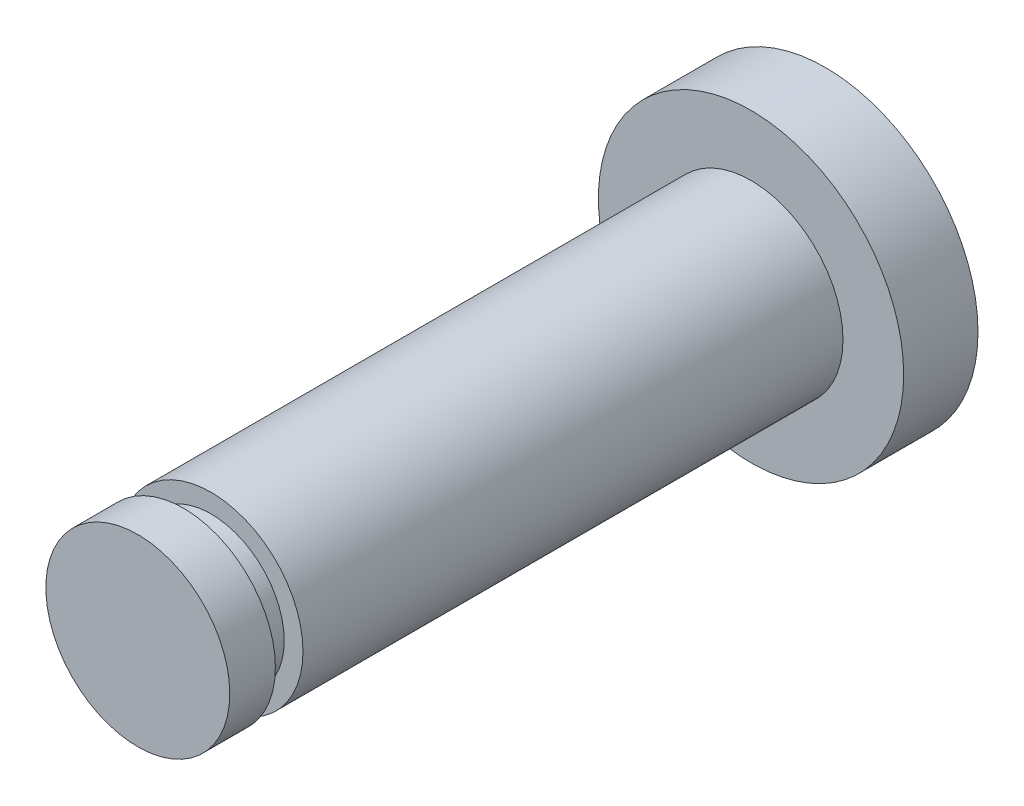
ISO-10303-21;
HEADER;
FILE_DESCRIPTION(('STEP AP214'),'2;1');
FILE_NAME('part.step','',(''),(''),'','','');
FILE_SCHEMA(('AUTOMOTIVE_DESIGN { 1 0 10303 214 1 1 1 1 }'));
ENDSEC;
DATA;
#1=APPLICATION_CONTEXT('core data for automotive mechanical design processes');
#2=APPLICATION_PROTOCOL_DEFINITION('international standard','automotive_design',2000,#1);
#3=PRODUCT_CONTEXT('',#1,'mechanical');
#4=PRODUCT('Part','Part','',(#3));
#5=PRODUCT_RELATED_PRODUCT_CATEGORY('part','',(#4));
#6=PRODUCT_DEFINITION_FORMATION('','',#4);
#7=PRODUCT_DEFINITION_CONTEXT('part definition',#1,'design');
#8=PRODUCT_DEFINITION('design','',#6,#7);
#9=PRODUCT_DEFINITION_SHAPE('','',#8);
#10=(LENGTH_UNIT() NAMED_UNIT(*) SI_UNIT(.MILLI.,.METRE.));
#11=(NAMED_UNIT(*) PLANE_ANGLE_UNIT() SI_UNIT($,.RADIAN.));
#12=(NAMED_UNIT(*) SI_UNIT($,.STERADIAN.) SOLID_ANGLE_UNIT());
#13=UNCERTAINTY_MEASURE_WITH_UNIT(LENGTH_MEASURE(1.E-05),#10,'distance_accuracy_value','');
#14=(GEOMETRIC_REPRESENTATION_CONTEXT(3) GLOBAL_UNCERTAINTY_ASSIGNED_CONTEXT((#13)) GLOBAL_UNIT_ASSIGNED_CONTEXT((#10,
#11,#12)) REPRESENTATION_CONTEXT('',''));
#15=CARTESIAN_POINT('',(0.,0.,0.));
#16=DIRECTION('',(0.,0.,1.));
#17=DIRECTION('',(1.,0.,0.));
#18=AXIS2_PLACEMENT_3D('',#15,#16,#17);
#19=CARTESIAN_POINT('',(0.,0.,9.44));
#20=DIRECTION('',(0.,0.,-1.));
#21=DIRECTION('',(-1.,0.,0.));
#22=AXIS2_PLACEMENT_3D('',#19,#20,#21);
#23=CYLINDRICAL_SURFACE('',#22,2.5);
#24=CARTESIAN_POINT('',(0.,0.,-7.23));
#25=DIRECTION('',(0.,0.,1.));
#26=DIRECTION('',(1.,0.,0.));
#27=AXIS2_PLACEMENT_3D('',#24,#25,#26);
#28=CIRCLE('',#27,2.5);
#29=CARTESIAN_POINT('',(2.5,0.,-7.23));
#30=VERTEX_POINT('',#29);
#31=EDGE_CURVE('E44',#30,#30,#28,.T.);
#32=ORIENTED_EDGE('',*,*,#31,.T.);
#33=EDGE_LOOP('',(#32));
#34=FACE_BOUND('',#33,.T.);
#35=CARTESIAN_POINT('',(0.,0.,7.45));
#36=DIRECTION('',(0.,0.,1.));
#37=DIRECTION('',(1.,0.,0.));
#38=AXIS2_PLACEMENT_3D('',#35,#36,#37);
#39=CIRCLE('',#38,2.5);
#40=CARTESIAN_POINT('',(2.5,0.,7.45));
#41=VERTEX_POINT('',#40);
#42=EDGE_CURVE('E54',#41,#41,#39,.T.);
#43=ORIENTED_EDGE('',*,*,#42,.F.);
#44=EDGE_LOOP('',(#43));
#45=FACE_BOUND('',#44,.T.);
#46=ADVANCED_FACE('F40',(#34,#45),#23,.T.);
#47=CARTESIAN_POINT('',(0.,0.,-7.23));
#48=DIRECTION('',(0.,0.,-1.));
#49=DIRECTION('',(-1.,0.,0.));
#50=AXIS2_PLACEMENT_3D('',#47,#48,#49);
#51=CYLINDRICAL_SURFACE('',#50,4.15);
#52=CARTESIAN_POINT('',(0.,0.,-7.23));
#53=DIRECTION('',(0.,0.,1.));
#54=DIRECTION('',(1.,0.,0.));
#55=AXIS2_PLACEMENT_3D('',#52,#53,#54);
#56=CIRCLE('',#55,4.15);
#57=CARTESIAN_POINT('',(4.15,0.,-7.23));
#58=VERTEX_POINT('',#57);
#59=EDGE_CURVE('E49',#58,#58,#56,.T.);
#60=ORIENTED_EDGE('',*,*,#59,.F.);
#61=EDGE_LOOP('',(#60));
#62=FACE_BOUND('',#61,.T.);
#63=CARTESIAN_POINT('',(0.,0.,-9.25));
#64=DIRECTION('',(0.,0.,1.));
#65=DIRECTION('',(1.,0.,0.));
#66=AXIS2_PLACEMENT_3D('',#63,#64,#65);
#67=CIRCLE('',#66,4.15);
#68=CARTESIAN_POINT('',(4.15,0.,-9.25));
#69=VERTEX_POINT('',#68);
#70=EDGE_CURVE('E52',#69,#69,#67,.T.);
#71=ORIENTED_EDGE('',*,*,#70,.T.);
#72=EDGE_LOOP('',(#71));
#73=FACE_BOUND('',#72,.T.);
#74=ADVANCED_FACE('F74',(#62,#73),#51,.T.);
#75=CARTESIAN_POINT('',(0.,0.,-7.23));
#76=DIRECTION('',(0.,0.,1.));
#77=DIRECTION('',(1.,0.,0.));
#78=AXIS2_PLACEMENT_3D('',#75,#76,#77);
#79=PLANE('',#78);
#80=ORIENTED_EDGE('',*,*,#31,.F.);
#81=EDGE_LOOP('',(#80));
#82=FACE_BOUND('',#81,.T.);
#83=ORIENTED_EDGE('',*,*,#59,.T.);
#84=EDGE_LOOP('',(#83));
#85=FACE_BOUND('',#84,.T.);
#86=ADVANCED_FACE('F76',(#82,#85),#79,.T.);
#87=CARTESIAN_POINT('',(0.,0.,-9.25));
#88=DIRECTION('',(0.,0.,1.));
#89=DIRECTION('',(1.,0.,0.));
#90=AXIS2_PLACEMENT_3D('',#87,#88,#89);
#91=PLANE('',#90);
#92=ORIENTED_EDGE('',*,*,#70,.F.);
#93=EDGE_LOOP('',(#92));
#94=FACE_BOUND('',#93,.T.);
#95=ADVANCED_FACE('F77',(#94),#91,.F.);
#96=CARTESIAN_POINT('',(0.,0.,8.2));
#97=DIRECTION('',(0.,0.,1.));
#98=DIRECTION('',(1.,0.,0.));
#99=AXIS2_PLACEMENT_3D('',#96,#97,#98);
#100=PLANE('',#99);
#101=CARTESIAN_POINT('',(0.,0.,8.2));
#102=DIRECTION('',(0.,0.,1.));
#103=DIRECTION('',(1.,0.,0.));
#104=AXIS2_PLACEMENT_3D('',#101,#102,#103);
#105=CIRCLE('',#104,1.99);
#106=CARTESIAN_POINT('',(1.99,0.,8.2));
#107=VERTEX_POINT('',#106);
#108=EDGE_CURVE('E60',#107,#107,#105,.T.);
#109=ORIENTED_EDGE('',*,*,#108,.T.);
#110=EDGE_LOOP('',(#109));
#111=FACE_BOUND('',#110,.T.);
#112=CARTESIAN_POINT('',(0.,0.,8.2));
#113=DIRECTION('',(0.,0.,1.));
#114=DIRECTION('',(1.,0.,0.));
#115=AXIS2_PLACEMENT_3D('',#112,#113,#114);
#116=CIRCLE('',#115,2.5);
#117=CARTESIAN_POINT('',(2.5,0.,8.2));
#118=VERTEX_POINT('',#117);
#119=EDGE_CURVE('E41',#118,#118,#116,.T.);
#120=ORIENTED_EDGE('',*,*,#119,.F.);
#121=EDGE_LOOP('',(#120));
#122=FACE_BOUND('',#121,.T.);
#123=ADVANCED_FACE('F79',(#111,#122),#100,.F.);
#124=CARTESIAN_POINT('',(0.,0.,7.45));
#125=DIRECTION('',(0.,0.,1.));
#126=DIRECTION('',(1.,0.,0.));
#127=AXIS2_PLACEMENT_3D('',#124,#125,#126);
#128=PLANE('',#127);
#129=CARTESIAN_POINT('',(0.,0.,7.45));
#130=DIRECTION('',(0.,0.,1.));
#131=DIRECTION('',(1.,0.,0.));
#132=AXIS2_PLACEMENT_3D('',#129,#130,#131);
#133=CIRCLE('',#132,1.99);
#134=CARTESIAN_POINT('',(1.99,0.,7.45));
#135=VERTEX_POINT('',#134);
#136=EDGE_CURVE('E65',#135,#135,#133,.T.);
#137=ORIENTED_EDGE('',*,*,#136,.F.);
#138=EDGE_LOOP('',(#137));
#139=FACE_BOUND('',#138,.T.);
#140=ORIENTED_EDGE('',*,*,#42,.T.);
#141=EDGE_LOOP('',(#140));
#142=FACE_BOUND('',#141,.T.);
#143=ADVANCED_FACE('F88',(#139,#142),#128,.T.);
#144=CARTESIAN_POINT('',(0.,0.,8.2));
#145=DIRECTION('',(0.,0.,-1.));
#146=DIRECTION('',(-1.,0.,0.));
#147=AXIS2_PLACEMENT_3D('',#144,#145,#146);
#148=CYLINDRICAL_SURFACE('',#147,1.99);
#149=ORIENTED_EDGE('',*,*,#108,.F.);
#150=EDGE_LOOP('',(#149));
#151=FACE_BOUND('',#150,.T.);
#152=ORIENTED_EDGE('',*,*,#136,.T.);
#153=EDGE_LOOP('',(#152));
#154=FACE_BOUND('',#153,.T.);
#155=ADVANCED_FACE('F102',(#151,#154),#148,.T.);
#156=CARTESIAN_POINT('',(0.,0.,9.44));
#157=DIRECTION('',(0.,0.,1.));
#158=DIRECTION('',(1.,0.,0.));
#159=AXIS2_PLACEMENT_3D('',#156,#157,#158);
#160=PLANE('',#159);
#161=CARTESIAN_POINT('',(0.,0.,9.44));
#162=DIRECTION('',(0.,0.,1.));
#163=DIRECTION('',(1.,0.,0.));
#164=AXIS2_PLACEMENT_3D('',#161,#162,#163);
#165=CIRCLE('',#164,2.5);
#166=CARTESIAN_POINT('',(2.5,0.,9.44));
#167=VERTEX_POINT('',#166);
#168=EDGE_CURVE('E10',#167,#167,#165,.T.);
#169=ORIENTED_EDGE('',*,*,#168,.T.);
#170=EDGE_LOOP('',(#169));
#171=FACE_BOUND('',#170,.T.);
#172=ADVANCED_FACE('F98',(#171),#160,.T.);
#173=ORIENTED_EDGE('',*,*,#119,.T.);
#174=EDGE_LOOP('',(#173));
#175=FACE_BOUND('',#174,.T.);
#176=ORIENTED_EDGE('',*,*,#168,.F.);
#177=EDGE_LOOP('',(#176));
#178=FACE_BOUND('',#177,.T.);
#179=ADVANCED_FACE('F39',(#175,#178),#23,.T.);
#180=CLOSED_SHELL('',(#46,#74,#86,#95,#123,#143,#155,#172,#179));
#181=MANIFOLD_SOLID_BREP('B2',#180);
#182=ADVANCED_BREP_SHAPE_REPRESENTATION('',(#18,#181),#14);
#183=SHAPE_DEFINITION_REPRESENTATION(#9,#182);
ENDSEC;
END-ISO-10303-21;
